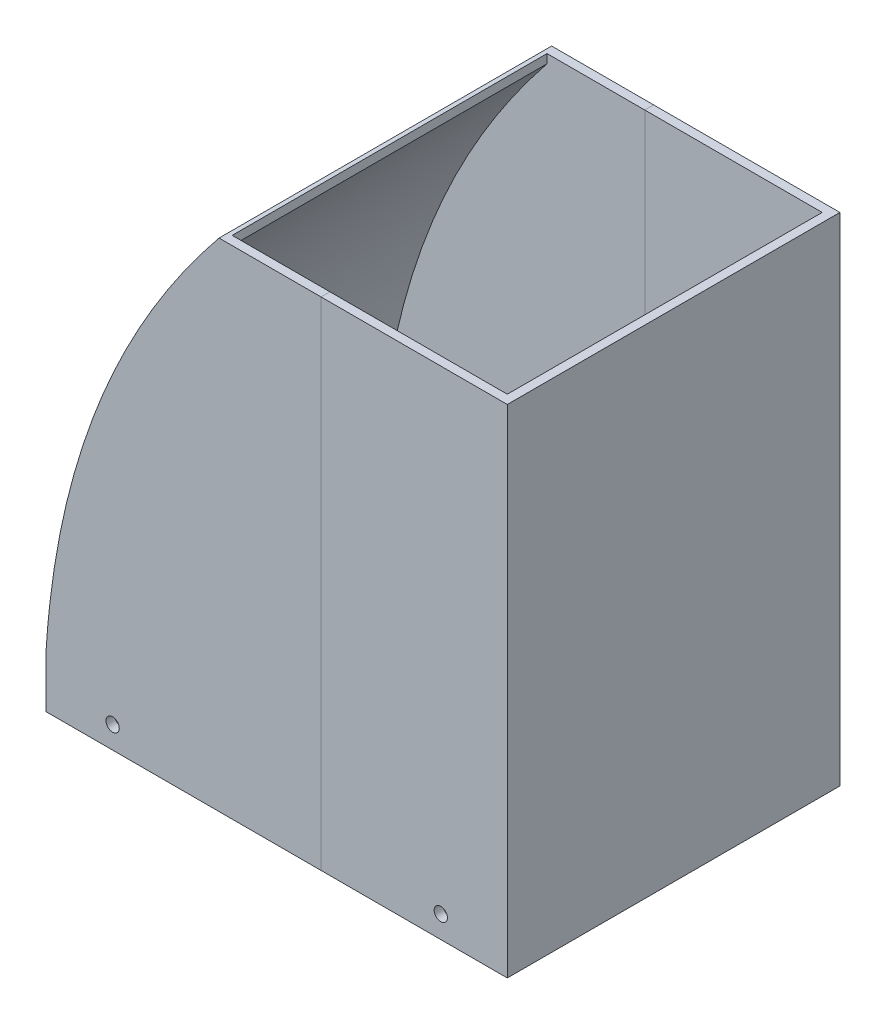
ISO-10303-21;
HEADER;
FILE_DESCRIPTION(('STEP AP214'),'2;1');
FILE_NAME('part.step','',(''),(''),'','','');
FILE_SCHEMA(('AUTOMOTIVE_DESIGN { 1 0 10303 214 1 1 1 1 }'));
ENDSEC;
DATA;
#1=APPLICATION_CONTEXT('core data for automotive mechanical design processes');
#2=APPLICATION_PROTOCOL_DEFINITION('international standard','automotive_design',2000,#1);
#3=PRODUCT_CONTEXT('',#1,'mechanical');
#4=PRODUCT('Part','Part','',(#3));
#5=PRODUCT_RELATED_PRODUCT_CATEGORY('part','',(#4));
#6=PRODUCT_DEFINITION_FORMATION('','',#4);
#7=PRODUCT_DEFINITION_CONTEXT('part definition',#1,'design');
#8=PRODUCT_DEFINITION('design','',#6,#7);
#9=PRODUCT_DEFINITION_SHAPE('','',#8);
#10=(LENGTH_UNIT() NAMED_UNIT(*) SI_UNIT(.MILLI.,.METRE.));
#11=(NAMED_UNIT(*) PLANE_ANGLE_UNIT() SI_UNIT($,.RADIAN.));
#12=(NAMED_UNIT(*) SI_UNIT($,.STERADIAN.) SOLID_ANGLE_UNIT());
#13=UNCERTAINTY_MEASURE_WITH_UNIT(LENGTH_MEASURE(1.E-05),#10,'distance_accuracy_value','');
#14=(GEOMETRIC_REPRESENTATION_CONTEXT(3) GLOBAL_UNCERTAINTY_ASSIGNED_CONTEXT((#13)) GLOBAL_UNIT_ASSIGNED_CONTEXT((#10,
#11,#12)) REPRESENTATION_CONTEXT('',''));
#15=CARTESIAN_POINT('',(0.,0.,0.));
#16=DIRECTION('',(0.,0.,1.));
#17=DIRECTION('',(1.,0.,0.));
#18=AXIS2_PLACEMENT_3D('',#15,#16,#17);
#19=CARTESIAN_POINT('',(10.,0.,0.));
#20=DIRECTION('',(1.,0.,0.));
#21=DIRECTION('',(0.,0.,-1.));
#22=AXIS2_PLACEMENT_3D('',#19,#20,#21);
#23=PLANE('',#22);
#24=DIRECTION('',(0.,0.,-1.));
#25=VECTOR('',#24,1.);
#26=CARTESIAN_POINT('',(10.,0.,0.));
#27=LINE('',#26,#25);
#28=CARTESIAN_POINT('',(10.,0.,-35.5));
#29=VERTEX_POINT('',#28);
#30=CARTESIAN_POINT('',(9.99999999999999,0.,-37.5));
#31=VERTEX_POINT('',#30);
#32=EDGE_CURVE('E164',#29,#31,#27,.T.);
#33=ORIENTED_EDGE('',*,*,#32,.T.);
#34=DIRECTION('',(0.,1.,0.));
#35=VECTOR('',#34,1.);
#36=CARTESIAN_POINT('',(10.,12.,-37.5));
#37=LINE('',#36,#35);
#38=CARTESIAN_POINT('',(10.,112.,-37.5));
#39=VERTEX_POINT('',#38);
#40=EDGE_CURVE('E157',#31,#39,#37,.T.);
#41=ORIENTED_EDGE('',*,*,#40,.T.);
#42=DIRECTION('',(0.,0.,-1.));
#43=VECTOR('',#42,1.);
#44=CARTESIAN_POINT('',(10.,112.,-37.5));
#45=LINE('',#44,#43);
#46=CARTESIAN_POINT('',(10.,112.,-35.5));
#47=VERTEX_POINT('',#46);
#48=EDGE_CURVE('E229',#47,#39,#45,.T.);
#49=ORIENTED_EDGE('',*,*,#48,.F.);
#50=DIRECTION('',(0.,1.,0.));
#51=VECTOR('',#50,1.);
#52=CARTESIAN_POINT('',(10.,12.,-35.5));
#53=LINE('',#52,#51);
#54=EDGE_CURVE('E226',#29,#47,#53,.T.);
#55=ORIENTED_EDGE('',*,*,#54,.F.);
#56=EDGE_LOOP('',(#33,#41,#49,#55));
#57=FACE_BOUND('',#56,.T.);
#58=ADVANCED_FACE('F50',(#57),#23,.T.);
#59=CARTESIAN_POINT('',(10.,112.,37.5));
#60=VERTEX_POINT('',#59);
#61=CARTESIAN_POINT('',(10.,112.,35.5));
#62=VERTEX_POINT('',#61);
#63=EDGE_CURVE('E155',#60,#62,#45,.T.);
#64=ORIENTED_EDGE('',*,*,#63,.F.);
#65=DIRECTION('',(0.,-1.,0.));
#66=VECTOR('',#65,1.);
#67=CARTESIAN_POINT('',(10.,12.,37.5));
#68=LINE('',#67,#66);
#69=CARTESIAN_POINT('',(10.,0.,37.5));
#70=VERTEX_POINT('',#69);
#71=EDGE_CURVE('E138',#60,#70,#68,.T.);
#72=ORIENTED_EDGE('',*,*,#71,.T.);
#73=CARTESIAN_POINT('',(10.,0.,35.5));
#74=VERTEX_POINT('',#73);
#75=EDGE_CURVE('E152',#70,#74,#27,.T.);
#76=ORIENTED_EDGE('',*,*,#75,.T.);
#77=DIRECTION('',(0.,-1.,0.));
#78=VECTOR('',#77,1.);
#79=CARTESIAN_POINT('',(10.,12.,35.5));
#80=LINE('',#79,#78);
#81=EDGE_CURVE('E222',#62,#74,#80,.T.);
#82=ORIENTED_EDGE('',*,*,#81,.F.);
#83=EDGE_LOOP('',(#64,#72,#76,#82));
#84=FACE_BOUND('',#83,.T.);
#85=ADVANCED_FACE('F151',(#84),#23,.T.);
#86=CARTESIAN_POINT('',(-52.,12.,-37.5));
#87=DIRECTION('',(1.,0.,0.));
#88=DIRECTION('',(0.,0.,-1.));
#89=AXIS2_PLACEMENT_3D('',#86,#87,#88);
#90=PLANE('',#89);
#91=DIRECTION('',(0.,0.,1.));
#92=VECTOR('',#91,1.);
#93=CARTESIAN_POINT('',(-52.,0.,-37.5));
#94=LINE('',#93,#92);
#95=CARTESIAN_POINT('',(-52.,0.,-37.5));
#96=VERTEX_POINT('',#95);
#97=CARTESIAN_POINT('',(-52.,0.,37.5));
#98=VERTEX_POINT('',#97);
#99=EDGE_CURVE('E146',#96,#98,#94,.T.);
#100=ORIENTED_EDGE('',*,*,#99,.T.);
#101=DIRECTION('',(0.,-1.,0.));
#102=VECTOR('',#101,1.);
#103=CARTESIAN_POINT('',(-52.,12.,37.5));
#104=LINE('',#103,#102);
#105=CARTESIAN_POINT('',(-52.,12.,37.5));
#106=VERTEX_POINT('',#105);
#107=EDGE_CURVE('E141',#106,#98,#104,.T.);
#108=ORIENTED_EDGE('',*,*,#107,.F.);
#109=DIRECTION('',(0.,0.,1.));
#110=VECTOR('',#109,1.);
#111=CARTESIAN_POINT('',(-52.,12.,-37.5));
#112=LINE('',#111,#110);
#113=CARTESIAN_POINT('',(-52.,12.,-37.5));
#114=VERTEX_POINT('',#113);
#115=EDGE_CURVE('E147',#114,#106,#112,.T.);
#116=ORIENTED_EDGE('',*,*,#115,.F.);
#117=DIRECTION('',(0.,-1.,0.));
#118=VECTOR('',#117,1.);
#119=CARTESIAN_POINT('',(-52.,12.,-37.5));
#120=LINE('',#119,#118);
#121=EDGE_CURVE('E225',#114,#96,#120,.T.);
#122=ORIENTED_EDGE('',*,*,#121,.T.);
#123=EDGE_LOOP('',(#100,#108,#116,#122));
#124=FACE_BOUND('',#123,.T.);
#125=ADVANCED_FACE('F319',(#124),#90,.F.);
#126=CARTESIAN_POINT('',(-13.0000000000001,112.,-37.5));
#127=CARTESIAN_POINT('',(-48.4598097712024,68.3634490424018,-37.5));
#128=CARTESIAN_POINT('',(-52.,12.,-37.5));
#129=B_SPLINE_CURVE_WITH_KNOTS('',2,(#126,#127,#128),.UNSPECIFIED.,.F.,.F.,(3,3),(0.,1.),.UNSPECIFIED.);
#130=DIRECTION('',(0.,0.,1.));
#131=VECTOR('',#130,1.);
#132=SURFACE_OF_LINEAR_EXTRUSION('',#129,#131);
#133=CARTESIAN_POINT('',(-13.0000000000001,112.,37.5));
#134=CARTESIAN_POINT('',(-48.4598097712024,68.3634490424018,37.5));
#135=CARTESIAN_POINT('',(-52.,12.,37.5));
#136=B_SPLINE_CURVE_WITH_KNOTS('',2,(#133,#134,#135),.UNSPECIFIED.,.F.,.F.,(3,3),(0.,1.),.UNSPECIFIED.);
#137=CARTESIAN_POINT('',(-13.0000000000001,112.,37.5));
#138=VERTEX_POINT('',#137);
#139=EDGE_CURVE('E177',#138,#106,#136,.T.);
#140=ORIENTED_EDGE('',*,*,#139,.F.);
#141=DIRECTION('',(0.,0.,1.));
#142=VECTOR('',#141,1.);
#143=CARTESIAN_POINT('',(-13.0000000000001,112.,-37.5));
#144=LINE('',#143,#142);
#145=CARTESIAN_POINT('',(-13.0000000000001,112.,-37.5));
#146=VERTEX_POINT('',#145);
#147=EDGE_CURVE('E173',#146,#138,#144,.T.);
#148=ORIENTED_EDGE('',*,*,#147,.F.);
#149=EDGE_CURVE('E178',#146,#114,#129,.T.);
#150=ORIENTED_EDGE('',*,*,#149,.T.);
#151=ORIENTED_EDGE('',*,*,#115,.T.);
#152=EDGE_LOOP('',(#140,#148,#150,#151));
#153=FACE_BOUND('',#152,.T.);
#154=ADVANCED_FACE('F247',(#153),#132,.T.);
#155=CARTESIAN_POINT('',(-52.,12.,-37.5));
#156=DIRECTION('',(0.,0.,1.));
#157=DIRECTION('',(1.,0.,0.));
#158=AXIS2_PLACEMENT_3D('',#155,#156,#157);
#159=PLANE('',#158);
#160=CARTESIAN_POINT('',(-37.,5.,-37.5));
#161=DIRECTION('',(0.,0.,1.));
#162=DIRECTION('',(1.,0.,0.));
#163=AXIS2_PLACEMENT_3D('',#160,#161,#162);
#164=CIRCLE('',#163,1.5);
#165=CARTESIAN_POINT('',(-35.5,5.,-37.5));
#166=VERTEX_POINT('',#165);
#167=EDGE_CURVE('E62',#166,#166,#164,.T.);
#168=ORIENTED_EDGE('',*,*,#167,.T.);
#169=EDGE_LOOP('',(#168));
#170=FACE_BOUND('',#169,.T.);
#171=ORIENTED_EDGE('',*,*,#40,.F.);
#172=DIRECTION('',(-1.,0.,0.));
#173=VECTOR('',#172,1.);
#174=CARTESIAN_POINT('',(-52.,0.,-37.5));
#175=LINE('',#174,#173);
#176=EDGE_CURVE('E170',#31,#96,#175,.T.);
#177=ORIENTED_EDGE('',*,*,#176,.T.);
#178=ORIENTED_EDGE('',*,*,#121,.F.);
#179=ORIENTED_EDGE('',*,*,#149,.F.);
#180=DIRECTION('',(-1.,0.,0.));
#181=VECTOR('',#180,1.);
#182=CARTESIAN_POINT('',(52.,112.,-37.5));
#183=LINE('',#182,#181);
#184=EDGE_CURVE('E174',#39,#146,#183,.T.);
#185=ORIENTED_EDGE('',*,*,#184,.F.);
#186=EDGE_LOOP('',(#171,#177,#178,#179,#185));
#187=FACE_BOUND('',#186,.T.);
#188=ADVANCED_FACE('F240',(#170,#187),#159,.F.);
#189=CARTESIAN_POINT('',(-52.,12.,37.5));
#190=DIRECTION('',(0.,0.,-1.));
#191=DIRECTION('',(-1.,0.,0.));
#192=AXIS2_PLACEMENT_3D('',#189,#190,#191);
#193=PLANE('',#192);
#194=CARTESIAN_POINT('',(-37.,5.,37.5));
#195=DIRECTION('',(0.,0.,1.));
#196=DIRECTION('',(1.,0.,0.));
#197=AXIS2_PLACEMENT_3D('',#194,#195,#196);
#198=CIRCLE('',#197,1.5);
#199=CARTESIAN_POINT('',(-35.5,5.,37.5));
#200=VERTEX_POINT('',#199);
#201=EDGE_CURVE('E13',#200,#200,#198,.T.);
#202=ORIENTED_EDGE('',*,*,#201,.F.);
#203=EDGE_LOOP('',(#202));
#204=FACE_BOUND('',#203,.T.);
#205=ORIENTED_EDGE('',*,*,#71,.F.);
#206=DIRECTION('',(-1.,0.,0.));
#207=VECTOR('',#206,1.);
#208=CARTESIAN_POINT('',(52.,112.,37.5));
#209=LINE('',#208,#207);
#210=EDGE_CURVE('E179',#60,#138,#209,.T.);
#211=ORIENTED_EDGE('',*,*,#210,.T.);
#212=ORIENTED_EDGE('',*,*,#139,.T.);
#213=ORIENTED_EDGE('',*,*,#107,.T.);
#214=DIRECTION('',(1.,0.,0.));
#215=VECTOR('',#214,1.);
#216=CARTESIAN_POINT('',(-52.,0.,37.5));
#217=LINE('',#216,#215);
#218=EDGE_CURVE('E135',#98,#70,#217,.T.);
#219=ORIENTED_EDGE('',*,*,#218,.T.);
#220=EDGE_LOOP('',(#205,#211,#212,#213,#219));
#221=FACE_BOUND('',#220,.T.);
#222=ADVANCED_FACE('F137',(#204,#221),#193,.F.);
#223=CARTESIAN_POINT('',(-12.0450935402186,112.,35.5));
#224=DIRECTION('',(-1.,0.,0.));
#225=DIRECTION('',(0.,-1.,0.));
#226=AXIS2_PLACEMENT_3D('',#223,#224,#225);
#227=PLANE('',#226);
#228=DIRECTION('',(0.,0.,1.));
#229=VECTOR('',#228,1.);
#230=CARTESIAN_POINT('',(-12.0450935402186,110.,-35.5));
#231=LINE('',#230,#229);
#232=CARTESIAN_POINT('',(-12.0450935402186,110.,-35.5));
#233=VERTEX_POINT('',#232);
#234=CARTESIAN_POINT('',(-12.0450935402186,110.,35.5));
#235=VERTEX_POINT('',#234);
#236=EDGE_CURVE('E189',#233,#235,#231,.T.);
#237=ORIENTED_EDGE('',*,*,#236,.F.);
#238=DIRECTION('',(0.,-1.,0.));
#239=VECTOR('',#238,1.);
#240=CARTESIAN_POINT('',(-12.0450935402186,112.,-35.5));
#241=LINE('',#240,#239);
#242=CARTESIAN_POINT('',(-12.0450935402186,112.,-35.5));
#243=VERTEX_POINT('',#242);
#244=EDGE_CURVE('E69',#243,#233,#241,.T.);
#245=ORIENTED_EDGE('',*,*,#244,.F.);
#246=DIRECTION('',(0.,0.,-1.));
#247=VECTOR('',#246,1.);
#248=CARTESIAN_POINT('',(-12.0450935402186,112.,35.5));
#249=LINE('',#248,#247);
#250=CARTESIAN_POINT('',(-12.0450935402186,112.,35.5));
#251=VERTEX_POINT('',#250);
#252=EDGE_CURVE('E193',#251,#243,#249,.T.);
#253=ORIENTED_EDGE('',*,*,#252,.F.);
#254=DIRECTION('',(0.,-1.,0.));
#255=VECTOR('',#254,1.);
#256=CARTESIAN_POINT('',(-12.0450935402186,112.,35.5));
#257=LINE('',#256,#255);
#258=EDGE_CURVE('E194',#251,#235,#257,.T.);
#259=ORIENTED_EDGE('',*,*,#258,.T.);
#260=EDGE_LOOP('',(#237,#245,#253,#259));
#261=FACE_BOUND('',#260,.T.);
#262=ADVANCED_FACE('F282',(#261),#227,.F.);
#263=CARTESIAN_POINT('',(-13.0000000000001,112.,-37.5));
#264=CARTESIAN_POINT('',(-48.4598097712024,68.3634490424018,-37.5));
#265=CARTESIAN_POINT('',(-52.,12.,-37.5));
#266=B_SPLINE_CURVE_WITH_KNOTS('',2,(#263,#264,#265),.UNSPECIFIED.,.F.,.F.,(3,3),(0.,1.),.UNSPECIFIED.);
#267=DIRECTION('',(0.,0.,1.));
#268=VECTOR('',#267,1.);
#269=SURFACE_OF_LINEAR_EXTRUSION('',#266,#268);
#270=OFFSET_SURFACE('',#269,-2.,.F.);
#271=CARTESIAN_POINT('',(-12.0450935402186,110.,35.5));
#272=CARTESIAN_POINT('',(-13.0442845313018,108.757810398391,35.5));
#273=CARTESIAN_POINT('',(-14.0278272882565,107.503001932952,35.5));
#274=CARTESIAN_POINT('',(-15.9623891529147,104.96831549086,35.5));
#275=CARTESIAN_POINT('',(-16.9134041743009,103.688434395975,35.5));
#276=CARTESIAN_POINT('',(-18.7814646121598,101.104037721084,35.5));
#277=CARTESIAN_POINT('',(-19.698508862466,99.7995212977005,35.5));
#278=CARTESIAN_POINT('',(-21.4969742758123,97.1668080235757,35.5));
#279=CARTESIAN_POINT('',(-22.3784075429143,95.838619443943,35.5));
#280=CARTESIAN_POINT('',(-24.1046903560787,93.1587339475502,35.5));
#281=CARTESIAN_POINT('',(-24.9495411540018,91.8070378374454,35.5));
#282=CARTESIAN_POINT('',(-26.6014812131027,89.0807793521403,35.5));
#283=CARTESIAN_POINT('',(-27.4085709470632,87.7062172635229,35.5));
#284=CARTESIAN_POINT('',(-28.9581275091827,84.9802875285094,35.5));
#285=CARTESIAN_POINT('',(-29.7018443478846,83.6296304105258,35.5));
#286=CARTESIAN_POINT('',(-31.1519736251426,80.9084258294078,35.5));
#287=CARTESIAN_POINT('',(-31.8583859527163,79.537878307114,35.5));
#288=CARTESIAN_POINT('',(-33.2330479330031,76.7778076315907,35.5));
#289=CARTESIAN_POINT('',(-33.9012983412077,75.3882848546897,35.5));
#290=CARTESIAN_POINT('',(-35.1990429263643,72.5909202966371,35.5));
#291=CARTESIAN_POINT('',(-35.8285293814212,71.183074932797,35.5));
#292=CARTESIAN_POINT('',(-37.0479913789742,68.350333074551,35.5));
#293=CARTESIAN_POINT('',(-37.6379659795101,66.9254361745915,35.5));
#294=CARTESIAN_POINT('',(-38.7779286022278,64.0596048610437,35.5));
#295=CARTESIAN_POINT('',(-39.3279133407107,62.6186691416322,35.5));
#296=CARTESIAN_POINT('',(-40.4341690445599,59.5943297135508,35.5));
#297=CARTESIAN_POINT('',(-40.9867205531453,58.0095640988418,35.5));
#298=CARTESIAN_POINT('',(-42.0437553168679,54.8237329698892,35.5));
#299=CARTESIAN_POINT('',(-42.5482287834835,53.2226642095126,35.5));
#300=CARTESIAN_POINT('',(-43.5089526733596,50.0057633689669,35.5));
#301=CARTESIAN_POINT('',(-43.9651930403952,48.3899282861298,35.5));
#302=CARTESIAN_POINT('',(-44.8294645173356,45.1450867592366,35.5));
#303=CARTESIAN_POINT('',(-45.2374862714721,43.5160778243794,35.5));
#304=CARTESIAN_POINT('',(-46.0055023806024,40.2465260395472,35.5));
#305=CARTESIAN_POINT('',(-46.3654895135196,38.6059814941222,35.5));
#306=CARTESIAN_POINT('',(-47.038833936755,35.3098854868856,35.5));
#307=CARTESIAN_POINT('',(-47.352038240524,33.654302794313,35.5));
#308=CARTESIAN_POINT('',(-47.9309707151973,30.3349686144209,35.5));
#309=CARTESIAN_POINT('',(-48.1967017345043,28.6712176233589,35.5));
#310=CARTESIAN_POINT('',(-48.6813601254276,25.3372621981366,35.5));
#311=CARTESIAN_POINT('',(-48.9002969014934,23.6670591295027,35.5));
#312=CARTESIAN_POINT('',(-49.2921760817379,20.321939814872,35.5));
#313=CARTESIAN_POINT('',(-49.4651363916117,18.6470256612085,35.5));
#314=CARTESIAN_POINT('',(-49.7660324666382,15.2942209793064,35.5));
#315=CARTESIAN_POINT('',(-49.8939966365321,13.6163330032197,35.5));
#316=CARTESIAN_POINT('',(-50.,11.9370901730026,35.5));
#317=B_SPLINE_CURVE_WITH_KNOTS('',3,(#271,#272,#273,#274,#275,#276,#277,#278,#279,#280,#281,
#282,#283,#284,#285,#286,#287,#288,#289,#290,#291,#292,#293,#294,#295,#296,#297,#298,#299,#300,
#301,#302,#303,#304,#305,#306,#307,#308,#309,#310,#311,#312,#313,#314,#315,#316),.UNSPECIFIED.,
.F.,.F.,(4,2,2,2,2,2,2,2,2,2,2,2,2,2,2,2,2,2,2,2,2,2,4),(0.,4.78245728821157,9.5655131852798,
14.3487331257417,19.1303133468221,23.9117298115903,28.6930863951859,33.3181513285633,
37.9432300209306,42.5682171188471,47.1941225673799,51.8201382579969,56.4465333779739,
61.4807438958199,66.5159771815259,71.5522582122664,76.5895148244745,81.6275279443538,
86.6816714351774,91.7355115748623,96.7883350645137,101.839187821742,106.886846375589),.UNSPECIFIED.);
#318=CARTESIAN_POINT('',(-50.,11.9370901730026,35.5));
#319=VERTEX_POINT('',#318);
#320=EDGE_CURVE('E206',#235,#319,#317,.T.);
#321=ORIENTED_EDGE('',*,*,#320,.T.);
#322=DIRECTION('',(0.,0.,1.));
#323=VECTOR('',#322,1.);
#324=CARTESIAN_POINT('',(-50.0000000000001,11.9370901730023,-35.5));
#325=LINE('',#324,#323);
#326=CARTESIAN_POINT('',(-50.0000000000001,11.9370901730023,-35.5));
#327=VERTEX_POINT('',#326);
#328=EDGE_CURVE('E186',#327,#319,#325,.T.);
#329=ORIENTED_EDGE('',*,*,#328,.F.);
#330=CARTESIAN_POINT('',(-12.0450935402186,110.,-35.5));
#331=CARTESIAN_POINT('',(-13.0442845313018,108.757810398391,-35.5));
#332=CARTESIAN_POINT('',(-14.0278272882565,107.503001932952,-35.5));
#333=CARTESIAN_POINT('',(-15.9623891529147,104.96831549086,-35.5));
#334=CARTESIAN_POINT('',(-16.9134041743009,103.688434395975,-35.5));
#335=CARTESIAN_POINT('',(-18.7814646121598,101.104037721084,-35.5));
#336=CARTESIAN_POINT('',(-19.698508862466,99.7995212977005,-35.5));
#337=CARTESIAN_POINT('',(-21.4969742758123,97.1668080235757,-35.5));
#338=CARTESIAN_POINT('',(-22.3784075429143,95.838619443943,-35.5));
#339=CARTESIAN_POINT('',(-24.1046903560787,93.1587339475502,-35.5));
#340=CARTESIAN_POINT('',(-24.9495411540018,91.8070378374454,-35.5));
#341=CARTESIAN_POINT('',(-26.6014812131027,89.0807793521403,-35.5));
#342=CARTESIAN_POINT('',(-27.4085709470632,87.7062172635229,-35.5));
#343=CARTESIAN_POINT('',(-28.9581275091827,84.9802875285094,-35.5));
#344=CARTESIAN_POINT('',(-29.7018443478846,83.6296304105258,-35.5));
#345=CARTESIAN_POINT('',(-31.1519736251426,80.9084258294078,-35.5));
#346=CARTESIAN_POINT('',(-31.8583859527163,79.537878307114,-35.5));
#347=CARTESIAN_POINT('',(-33.2330479330031,76.7778076315907,-35.5));
#348=CARTESIAN_POINT('',(-33.9012983412077,75.3882848546897,-35.5));
#349=CARTESIAN_POINT('',(-35.1990429263642,72.5909202966371,-35.5));
#350=CARTESIAN_POINT('',(-35.8285293814212,71.183074932797,-35.5));
#351=CARTESIAN_POINT('',(-37.0479913789742,68.350333074551,-35.5));
#352=CARTESIAN_POINT('',(-37.6379659795101,66.9254361745915,-35.5));
#353=CARTESIAN_POINT('',(-38.7779286022278,64.0596048610437,-35.5));
#354=CARTESIAN_POINT('',(-39.3279133407107,62.6186691416322,-35.5));
#355=CARTESIAN_POINT('',(-40.43416904456,59.5943297135508,-35.5));
#356=CARTESIAN_POINT('',(-40.9867205531453,58.0095640988418,-35.5));
#357=CARTESIAN_POINT('',(-42.043755316868,54.8237329698891,-35.5));
#358=CARTESIAN_POINT('',(-42.5482287834835,53.2226642095126,-35.5));
#359=CARTESIAN_POINT('',(-43.5089526733596,50.0057633689669,-35.5));
#360=CARTESIAN_POINT('',(-43.9651930403952,48.3899282861298,-35.5));
#361=CARTESIAN_POINT('',(-44.8294645173357,45.1450867592365,-35.5));
#362=CARTESIAN_POINT('',(-45.2374862714721,43.5160778243793,-35.5));
#363=CARTESIAN_POINT('',(-46.0055023806024,40.2465260395471,-35.5));
#364=CARTESIAN_POINT('',(-46.3654895135196,38.605981494122,-35.5));
#365=CARTESIAN_POINT('',(-47.038833936755,35.3098854868855,-35.5));
#366=CARTESIAN_POINT('',(-47.352038240524,33.6543027943129,-35.5));
#367=CARTESIAN_POINT('',(-47.9309707151973,30.3349686144208,-35.5));
#368=CARTESIAN_POINT('',(-48.1967017345043,28.6712176233587,-35.5));
#369=CARTESIAN_POINT('',(-48.6813601254276,25.3372621981364,-35.5));
#370=CARTESIAN_POINT('',(-48.9002969014934,23.6670591295025,-35.5));
#371=CARTESIAN_POINT('',(-49.2921760817379,20.3219398148717,-35.5));
#372=CARTESIAN_POINT('',(-49.4651363916117,18.6470256612082,-35.5));
#373=CARTESIAN_POINT('',(-49.7660324666382,15.2942209793062,-35.5));
#374=CARTESIAN_POINT('',(-49.8939966365322,13.6163330032194,-35.5));
#375=CARTESIAN_POINT('',(-50.0000000000001,11.9370901730023,-35.5));
#376=B_SPLINE_CURVE_WITH_KNOTS('',3,(#330,#331,#332,#333,#334,#335,#336,#337,#338,#339,#340,
#341,#342,#343,#344,#345,#346,#347,#348,#349,#350,#351,#352,#353,#354,#355,#356,#357,#358,#359,
#360,#361,#362,#363,#364,#365,#366,#367,#368,#369,#370,#371,#372,#373,#374,#375),.UNSPECIFIED.,
.F.,.F.,(4,2,2,2,2,2,2,2,2,2,2,2,2,2,2,2,2,2,2,2,2,2,4),(0.,4.78245728821157,9.56551318527979,
14.3487331257417,19.1303133468221,23.9117298115903,28.6930863951859,33.3181513285633,
37.9432300209306,42.5682171188471,47.1941225673799,51.8201382579969,56.4465333779739,
61.48074389582,66.5159771815259,71.5522582122665,76.5895148244745,81.627527944354,
86.6816714351776,91.7355115748625,96.7883350645139,101.839187821742,106.886846375589),.UNSPECIFIED.);
#377=EDGE_CURVE('E266',#233,#327,#376,.T.);
#378=ORIENTED_EDGE('',*,*,#377,.F.);
#379=ORIENTED_EDGE('',*,*,#236,.T.);
#380=EDGE_LOOP('',(#321,#329,#378,#379));
#381=FACE_BOUND('',#380,.T.);
#382=ADVANCED_FACE('F276',(#381),#270,.F.);
#383=CARTESIAN_POINT('',(-50.,12.,-37.5));
#384=DIRECTION('',(1.,0.,0.));
#385=DIRECTION('',(0.,0.,-1.));
#386=AXIS2_PLACEMENT_3D('',#383,#384,#385);
#387=PLANE('',#386);
#388=DIRECTION('',(0.,0.,1.));
#389=VECTOR('',#388,1.);
#390=CARTESIAN_POINT('',(-50.,0.,-37.5));
#391=LINE('',#390,#389);
#392=CARTESIAN_POINT('',(-50.,0.,-35.5));
#393=VERTEX_POINT('',#392);
#394=CARTESIAN_POINT('',(-50.,0.,35.5));
#395=VERTEX_POINT('',#394);
#396=EDGE_CURVE('E185',#393,#395,#391,.T.);
#397=ORIENTED_EDGE('',*,*,#396,.F.);
#398=DIRECTION('',(0.,-1.,0.));
#399=VECTOR('',#398,1.);
#400=CARTESIAN_POINT('',(-50.,12.,-35.5));
#401=LINE('',#400,#399);
#402=EDGE_CURVE('E182',#327,#393,#401,.T.);
#403=ORIENTED_EDGE('',*,*,#402,.F.);
#404=ORIENTED_EDGE('',*,*,#328,.T.);
#405=DIRECTION('',(0.,-1.,0.));
#406=VECTOR('',#405,1.);
#407=CARTESIAN_POINT('',(-50.,12.,35.5));
#408=LINE('',#407,#406);
#409=EDGE_CURVE('E294',#319,#395,#408,.T.);
#410=ORIENTED_EDGE('',*,*,#409,.T.);
#411=EDGE_LOOP('',(#397,#403,#404,#410));
#412=FACE_BOUND('',#411,.T.);
#413=ADVANCED_FACE('F281',(#412),#387,.T.);
#414=CARTESIAN_POINT('',(0.,0.,0.));
#415=DIRECTION('',(0.,1.,0.));
#416=DIRECTION('',(0.,0.,1.));
#417=AXIS2_PLACEMENT_3D('',#414,#415,#416);
#418=PLANE('',#417);
#419=ORIENTED_EDGE('',*,*,#75,.F.);
#420=ORIENTED_EDGE('',*,*,#218,.F.);
#421=ORIENTED_EDGE('',*,*,#99,.F.);
#422=ORIENTED_EDGE('',*,*,#176,.F.);
#423=ORIENTED_EDGE('',*,*,#32,.F.);
#424=DIRECTION('',(-1.,0.,0.));
#425=VECTOR('',#424,1.);
#426=CARTESIAN_POINT('',(-52.,0.,-35.5));
#427=LINE('',#426,#425);
#428=EDGE_CURVE('E187',#29,#393,#427,.T.);
#429=ORIENTED_EDGE('',*,*,#428,.T.);
#430=ORIENTED_EDGE('',*,*,#396,.T.);
#431=DIRECTION('',(1.,0.,0.));
#432=VECTOR('',#431,1.);
#433=CARTESIAN_POINT('',(-52.,0.,35.5));
#434=LINE('',#433,#432);
#435=EDGE_CURVE('E162',#395,#74,#434,.T.);
#436=ORIENTED_EDGE('',*,*,#435,.T.);
#437=EDGE_LOOP('',(#419,#420,#421,#422,#423,#429,#430,#436));
#438=FACE_BOUND('',#437,.T.);
#439=ADVANCED_FACE('F159',(#438),#418,.F.);
#440=CARTESIAN_POINT('',(52.,112.,-37.5));
#441=DIRECTION('',(0.,1.,0.));
#442=DIRECTION('',(-1.,0.,0.));
#443=AXIS2_PLACEMENT_3D('',#440,#441,#442);
#444=PLANE('',#443);
#445=ORIENTED_EDGE('',*,*,#210,.F.);
#446=ORIENTED_EDGE('',*,*,#63,.T.);
#447=DIRECTION('',(-1.,0.,0.));
#448=VECTOR('',#447,1.);
#449=CARTESIAN_POINT('',(50.,112.,35.5));
#450=LINE('',#449,#448);
#451=EDGE_CURVE('E55',#62,#251,#450,.T.);
#452=ORIENTED_EDGE('',*,*,#451,.T.);
#453=ORIENTED_EDGE('',*,*,#252,.T.);
#454=DIRECTION('',(1.,0.,0.));
#455=VECTOR('',#454,1.);
#456=CARTESIAN_POINT('',(-12.0450935402186,112.,-35.5));
#457=LINE('',#456,#455);
#458=EDGE_CURVE('E190',#243,#47,#457,.T.);
#459=ORIENTED_EDGE('',*,*,#458,.T.);
#460=ORIENTED_EDGE('',*,*,#48,.T.);
#461=ORIENTED_EDGE('',*,*,#184,.T.);
#462=ORIENTED_EDGE('',*,*,#147,.T.);
#463=EDGE_LOOP('',(#445,#446,#452,#453,#459,#460,#461,#462));
#464=FACE_BOUND('',#463,.T.);
#465=ADVANCED_FACE('F244',(#464),#444,.T.);
#466=CARTESIAN_POINT('',(-37.,5.,-37.5));
#467=DIRECTION('',(0.,0.,1.));
#468=DIRECTION('',(1.,0.,0.));
#469=AXIS2_PLACEMENT_3D('',#466,#467,#468);
#470=CYLINDRICAL_SURFACE('',#469,1.5);
#471=CARTESIAN_POINT('',(-37.,5.,35.5));
#472=DIRECTION('',(0.,0.,-1.));
#473=DIRECTION('',(-1.,0.,0.));
#474=AXIS2_PLACEMENT_3D('',#471,#472,#473);
#475=CIRCLE('',#474,1.5);
#476=CARTESIAN_POINT('',(-38.5,5.,35.5));
#477=VERTEX_POINT('',#476);
#478=EDGE_CURVE('E217',#477,#477,#475,.T.);
#479=ORIENTED_EDGE('',*,*,#478,.T.);
#480=EDGE_LOOP('',(#479));
#481=FACE_BOUND('',#480,.T.);
#482=ORIENTED_EDGE('',*,*,#201,.T.);
#483=EDGE_LOOP('',(#482));
#484=FACE_BOUND('',#483,.T.);
#485=ADVANCED_FACE('F303',(#481,#484),#470,.F.);
#486=CARTESIAN_POINT('',(-52.,12.,35.5));
#487=DIRECTION('',(0.,0.,-1.));
#488=DIRECTION('',(-1.,0.,0.));
#489=AXIS2_PLACEMENT_3D('',#486,#487,#488);
#490=PLANE('',#489);
#491=ORIENTED_EDGE('',*,*,#478,.F.);
#492=EDGE_LOOP('',(#491));
#493=FACE_BOUND('',#492,.T.);
#494=ORIENTED_EDGE('',*,*,#451,.F.);
#495=ORIENTED_EDGE('',*,*,#81,.T.);
#496=ORIENTED_EDGE('',*,*,#435,.F.);
#497=ORIENTED_EDGE('',*,*,#409,.F.);
#498=ORIENTED_EDGE('',*,*,#320,.F.);
#499=ORIENTED_EDGE('',*,*,#258,.F.);
#500=EDGE_LOOP('',(#494,#495,#496,#497,#498,#499));
#501=FACE_BOUND('',#500,.T.);
#502=ADVANCED_FACE('F52',(#493,#501),#490,.T.);
#503=CARTESIAN_POINT('',(-37.,5.,-35.5));
#504=DIRECTION('',(0.,0.,1.));
#505=DIRECTION('',(1.,0.,0.));
#506=AXIS2_PLACEMENT_3D('',#503,#504,#505);
#507=CIRCLE('',#506,1.5);
#508=CARTESIAN_POINT('',(-35.5,5.,-35.5));
#509=VERTEX_POINT('',#508);
#510=EDGE_CURVE('E214',#509,#509,#507,.T.);
#511=ORIENTED_EDGE('',*,*,#510,.T.);
#512=EDGE_LOOP('',(#511));
#513=FACE_BOUND('',#512,.T.);
#514=ORIENTED_EDGE('',*,*,#167,.F.);
#515=EDGE_LOOP('',(#514));
#516=FACE_BOUND('',#515,.T.);
#517=ADVANCED_FACE('F299',(#513,#516),#470,.F.);
#518=CARTESIAN_POINT('',(-52.,12.,-35.5));
#519=DIRECTION('',(0.,0.,1.));
#520=DIRECTION('',(1.,0.,0.));
#521=AXIS2_PLACEMENT_3D('',#518,#519,#520);
#522=PLANE('',#521);
#523=ORIENTED_EDGE('',*,*,#510,.F.);
#524=EDGE_LOOP('',(#523));
#525=FACE_BOUND('',#524,.T.);
#526=ORIENTED_EDGE('',*,*,#428,.F.);
#527=ORIENTED_EDGE('',*,*,#54,.T.);
#528=ORIENTED_EDGE('',*,*,#458,.F.);
#529=ORIENTED_EDGE('',*,*,#244,.T.);
#530=ORIENTED_EDGE('',*,*,#377,.T.);
#531=ORIENTED_EDGE('',*,*,#402,.T.);
#532=EDGE_LOOP('',(#526,#527,#528,#529,#530,#531));
#533=FACE_BOUND('',#532,.T.);
#534=ADVANCED_FACE('F295',(#525,#533),#522,.T.);
#535=CLOSED_SHELL('',(#58,#85,#125,#154,#188,#222,#262,#382,#413,#439,#465,#485,#502,#517,#534));
#536=MANIFOLD_SOLID_BREP('B2',#535);
#537=CARTESIAN_POINT('',(10.,0.,0.));
#538=DIRECTION('',(1.,0.,0.));
#539=DIRECTION('',(0.,0.,-1.));
#540=AXIS2_PLACEMENT_3D('',#537,#538,#539);
#541=PLANE('',#540);
#542=DIRECTION('',(0.,0.,-1.));
#543=VECTOR('',#542,1.);
#544=CARTESIAN_POINT('',(10.,0.,0.));
#545=LINE('',#544,#543);
#546=CARTESIAN_POINT('',(10.,0.,-35.5));
#547=VERTEX_POINT('',#546);
#548=CARTESIAN_POINT('',(9.99999999999999,0.,-37.5));
#549=VERTEX_POINT('',#548);
#550=EDGE_CURVE('E597',#547,#549,#545,.T.);
#551=ORIENTED_EDGE('',*,*,#550,.F.);
#552=DIRECTION('',(0.,1.,0.));
#553=VECTOR('',#552,1.);
#554=CARTESIAN_POINT('',(10.,12.,-35.5));
#555=LINE('',#554,#553);
#556=CARTESIAN_POINT('',(10.,112.,-35.5));
#557=VERTEX_POINT('',#556);
#558=EDGE_CURVE('E481',#547,#557,#555,.T.);
#559=ORIENTED_EDGE('',*,*,#558,.T.);
#560=DIRECTION('',(0.,0.,-1.));
#561=VECTOR('',#560,1.);
#562=CARTESIAN_POINT('',(10.,112.,-37.5));
#563=LINE('',#562,#561);
#564=CARTESIAN_POINT('',(10.,112.,-37.5));
#565=VERTEX_POINT('',#564);
#566=EDGE_CURVE('E548',#557,#565,#563,.T.);
#567=ORIENTED_EDGE('',*,*,#566,.T.);
#568=DIRECTION('',(0.,1.,0.));
#569=VECTOR('',#568,1.);
#570=CARTESIAN_POINT('',(10.,12.,-37.5));
#571=LINE('',#570,#569);
#572=EDGE_CURVE('E476',#549,#565,#571,.T.);
#573=ORIENTED_EDGE('',*,*,#572,.F.);
#574=EDGE_LOOP('',(#551,#559,#567,#573));
#575=FACE_BOUND('',#574,.T.);
#576=ADVANCED_FACE('F473',(#575),#541,.F.);
#577=CARTESIAN_POINT('',(10.,112.,37.5));
#578=VERTEX_POINT('',#577);
#579=CARTESIAN_POINT('',(10.,112.,35.5));
#580=VERTEX_POINT('',#579);
#581=EDGE_CURVE('E604',#578,#580,#563,.T.);
#582=ORIENTED_EDGE('',*,*,#581,.T.);
#583=DIRECTION('',(0.,-1.,0.));
#584=VECTOR('',#583,1.);
#585=CARTESIAN_POINT('',(10.,12.,35.5));
#586=LINE('',#585,#584);
#587=CARTESIAN_POINT('',(10.,0.,35.5));
#588=VERTEX_POINT('',#587);
#589=EDGE_CURVE('E48',#580,#588,#586,.T.);
#590=ORIENTED_EDGE('',*,*,#589,.T.);
#591=CARTESIAN_POINT('',(10.,0.,37.5));
#592=VERTEX_POINT('',#591);
#593=EDGE_CURVE('E489',#592,#588,#545,.T.);
#594=ORIENTED_EDGE('',*,*,#593,.F.);
#595=DIRECTION('',(0.,-1.,0.));
#596=VECTOR('',#595,1.);
#597=CARTESIAN_POINT('',(10.,12.,37.5));
#598=LINE('',#597,#596);
#599=EDGE_CURVE('E606',#578,#592,#598,.T.);
#600=ORIENTED_EDGE('',*,*,#599,.F.);
#601=EDGE_LOOP('',(#582,#590,#594,#600));
#602=FACE_BOUND('',#601,.T.);
#603=ADVANCED_FACE('F630',(#602),#541,.F.);
#604=CARTESIAN_POINT('',(51.9999999999999,12.,-37.5));
#605=DIRECTION('',(-1.,0.,0.));
#606=DIRECTION('',(0.,0.,1.));
#607=AXIS2_PLACEMENT_3D('',#604,#605,#606);
#608=PLANE('',#607);
#609=DIRECTION('',(0.,0.,-1.));
#610=VECTOR('',#609,1.);
#611=CARTESIAN_POINT('',(51.9999999999999,0.,-37.5));
#612=LINE('',#611,#610);
#613=CARTESIAN_POINT('',(52.,0.,37.5));
#614=VERTEX_POINT('',#613);
#615=CARTESIAN_POINT('',(51.9999999999999,0.,-37.5));
#616=VERTEX_POINT('',#615);
#617=EDGE_CURVE('E583',#614,#616,#612,.T.);
#618=ORIENTED_EDGE('',*,*,#617,.T.);
#619=DIRECTION('',(0.,-1.,0.));
#620=VECTOR('',#619,1.);
#621=CARTESIAN_POINT('',(51.9999999999999,12.,-37.5));
#622=LINE('',#621,#620);
#623=CARTESIAN_POINT('',(52.,112.,-37.5));
#624=VERTEX_POINT('',#623);
#625=EDGE_CURVE('E594',#624,#616,#622,.T.);
#626=ORIENTED_EDGE('',*,*,#625,.F.);
#627=DIRECTION('',(0.,0.,1.));
#628=VECTOR('',#627,1.);
#629=CARTESIAN_POINT('',(52.,112.,-37.5));
#630=LINE('',#629,#628);
#631=CARTESIAN_POINT('',(52.,112.,37.5));
#632=VERTEX_POINT('',#631);
#633=EDGE_CURVE('E578',#624,#632,#630,.T.);
#634=ORIENTED_EDGE('',*,*,#633,.T.);
#635=DIRECTION('',(0.,-1.,0.));
#636=VECTOR('',#635,1.);
#637=CARTESIAN_POINT('',(52.,12.,37.5));
#638=LINE('',#637,#636);
#639=EDGE_CURVE('E591',#632,#614,#638,.T.);
#640=ORIENTED_EDGE('',*,*,#639,.T.);
#641=EDGE_LOOP('',(#618,#626,#634,#640));
#642=FACE_BOUND('',#641,.T.);
#643=ADVANCED_FACE('F637',(#642),#608,.F.);
#644=CARTESIAN_POINT('',(-52.,12.,-37.5));
#645=DIRECTION('',(0.,0.,1.));
#646=DIRECTION('',(1.,0.,0.));
#647=AXIS2_PLACEMENT_3D('',#644,#645,#646);
#648=PLANE('',#647);
#649=CARTESIAN_POINT('',(37.,5.,-37.5));
#650=DIRECTION('',(0.,0.,1.));
#651=DIRECTION('',(1.,0.,0.));
#652=AXIS2_PLACEMENT_3D('',#649,#650,#651);
#653=CIRCLE('',#652,1.5);
#654=CARTESIAN_POINT('',(38.5,5.,-37.5));
#655=VERTEX_POINT('',#654);
#656=EDGE_CURVE('E601',#655,#655,#653,.T.);
#657=ORIENTED_EDGE('',*,*,#656,.T.);
#658=EDGE_LOOP('',(#657));
#659=FACE_BOUND('',#658,.T.);
#660=DIRECTION('',(-1.,0.,0.));
#661=VECTOR('',#660,1.);
#662=CARTESIAN_POINT('',(-52.,0.,-37.5));
#663=LINE('',#662,#661);
#664=EDGE_CURVE('E586',#616,#549,#663,.T.);
#665=ORIENTED_EDGE('',*,*,#664,.T.);
#666=ORIENTED_EDGE('',*,*,#572,.T.);
#667=DIRECTION('',(-1.,0.,0.));
#668=VECTOR('',#667,1.);
#669=CARTESIAN_POINT('',(52.,112.,-37.5));
#670=LINE('',#669,#668);
#671=EDGE_CURVE('E576',#624,#565,#670,.T.);
#672=ORIENTED_EDGE('',*,*,#671,.F.);
#673=ORIENTED_EDGE('',*,*,#625,.T.);
#674=EDGE_LOOP('',(#665,#666,#672,#673));
#675=FACE_BOUND('',#674,.T.);
#676=ADVANCED_FACE('F622',(#659,#675),#648,.F.);
#677=CARTESIAN_POINT('',(-52.,12.,37.5));
#678=DIRECTION('',(0.,0.,-1.));
#679=DIRECTION('',(-1.,0.,0.));
#680=AXIS2_PLACEMENT_3D('',#677,#678,#679);
#681=PLANE('',#680);
#682=CARTESIAN_POINT('',(37.,5.,37.5));
#683=DIRECTION('',(0.,0.,1.));
#684=DIRECTION('',(1.,0.,0.));
#685=AXIS2_PLACEMENT_3D('',#682,#683,#684);
#686=CIRCLE('',#685,1.5);
#687=CARTESIAN_POINT('',(38.5,5.,37.5));
#688=VERTEX_POINT('',#687);
#689=EDGE_CURVE('E616',#688,#688,#686,.T.);
#690=ORIENTED_EDGE('',*,*,#689,.F.);
#691=EDGE_LOOP('',(#690));
#692=FACE_BOUND('',#691,.T.);
#693=DIRECTION('',(-1.,0.,0.));
#694=VECTOR('',#693,1.);
#695=CARTESIAN_POINT('',(52.,112.,37.5));
#696=LINE('',#695,#694);
#697=EDGE_CURVE('E562',#632,#578,#696,.T.);
#698=ORIENTED_EDGE('',*,*,#697,.T.);
#699=ORIENTED_EDGE('',*,*,#599,.T.);
#700=DIRECTION('',(1.,0.,0.));
#701=VECTOR('',#700,1.);
#702=CARTESIAN_POINT('',(-52.,0.,37.5));
#703=LINE('',#702,#701);
#704=EDGE_CURVE('E589',#592,#614,#703,.T.);
#705=ORIENTED_EDGE('',*,*,#704,.T.);
#706=ORIENTED_EDGE('',*,*,#639,.F.);
#707=EDGE_LOOP('',(#698,#699,#705,#706));
#708=FACE_BOUND('',#707,.T.);
#709=ADVANCED_FACE('F661',(#692,#708),#681,.F.);
#710=CARTESIAN_POINT('',(0.,0.,0.));
#711=DIRECTION('',(0.,1.,0.));
#712=DIRECTION('',(0.,0.,1.));
#713=AXIS2_PLACEMENT_3D('',#710,#711,#712);
#714=PLANE('',#713);
#715=ORIENTED_EDGE('',*,*,#704,.F.);
#716=ORIENTED_EDGE('',*,*,#593,.T.);
#717=DIRECTION('',(1.,0.,0.));
#718=VECTOR('',#717,1.);
#719=CARTESIAN_POINT('',(-52.,0.,35.5));
#720=LINE('',#719,#718);
#721=CARTESIAN_POINT('',(50.,0.,35.5));
#722=VERTEX_POINT('',#721);
#723=EDGE_CURVE('E572',#588,#722,#720,.T.);
#724=ORIENTED_EDGE('',*,*,#723,.T.);
#725=DIRECTION('',(0.,0.,-1.));
#726=VECTOR('',#725,1.);
#727=CARTESIAN_POINT('',(49.9999999999999,0.,-37.5));
#728=LINE('',#727,#726);
#729=CARTESIAN_POINT('',(49.9999999999999,0.,-35.5));
#730=VERTEX_POINT('',#729);
#731=EDGE_CURVE('E567',#722,#730,#728,.T.);
#732=ORIENTED_EDGE('',*,*,#731,.T.);
#733=DIRECTION('',(-1.,0.,0.));
#734=VECTOR('',#733,1.);
#735=CARTESIAN_POINT('',(-52.,0.,-35.5));
#736=LINE('',#735,#734);
#737=EDGE_CURVE('E558',#730,#547,#736,.T.);
#738=ORIENTED_EDGE('',*,*,#737,.T.);
#739=ORIENTED_EDGE('',*,*,#550,.T.);
#740=ORIENTED_EDGE('',*,*,#664,.F.);
#741=ORIENTED_EDGE('',*,*,#617,.F.);
#742=EDGE_LOOP('',(#715,#716,#724,#732,#738,#739,#740,#741));
#743=FACE_BOUND('',#742,.T.);
#744=ADVANCED_FACE('F610',(#743),#714,.F.);
#745=CARTESIAN_POINT('',(52.,112.,-37.5));
#746=DIRECTION('',(0.,1.,0.));
#747=DIRECTION('',(-1.,0.,0.));
#748=AXIS2_PLACEMENT_3D('',#745,#746,#747);
#749=PLANE('',#748);
#750=ORIENTED_EDGE('',*,*,#581,.F.);
#751=ORIENTED_EDGE('',*,*,#697,.F.);
#752=ORIENTED_EDGE('',*,*,#633,.F.);
#753=ORIENTED_EDGE('',*,*,#671,.T.);
#754=ORIENTED_EDGE('',*,*,#566,.F.);
#755=DIRECTION('',(1.,0.,0.));
#756=VECTOR('',#755,1.);
#757=CARTESIAN_POINT('',(-12.0450935402186,112.,-35.5));
#758=LINE('',#757,#756);
#759=CARTESIAN_POINT('',(49.9999999999999,112.,-35.5));
#760=VERTEX_POINT('',#759);
#761=EDGE_CURVE('E539',#557,#760,#758,.T.);
#762=ORIENTED_EDGE('',*,*,#761,.T.);
#763=DIRECTION('',(0.,0.,1.));
#764=VECTOR('',#763,1.);
#765=CARTESIAN_POINT('',(49.9999999999999,112.,-35.5));
#766=LINE('',#765,#764);
#767=CARTESIAN_POINT('',(50.,112.,35.5));
#768=VERTEX_POINT('',#767);
#769=EDGE_CURVE('E545',#760,#768,#766,.T.);
#770=ORIENTED_EDGE('',*,*,#769,.T.);
#771=DIRECTION('',(-1.,0.,0.));
#772=VECTOR('',#771,1.);
#773=CARTESIAN_POINT('',(50.,112.,35.5));
#774=LINE('',#773,#772);
#775=EDGE_CURVE('E551',#768,#580,#774,.T.);
#776=ORIENTED_EDGE('',*,*,#775,.T.);
#777=EDGE_LOOP('',(#750,#751,#752,#753,#754,#762,#770,#776));
#778=FACE_BOUND('',#777,.T.);
#779=ADVANCED_FACE('F542',(#778),#749,.T.);
#780=CARTESIAN_POINT('',(49.9999999999999,12.,-37.5));
#781=DIRECTION('',(-1.,0.,0.));
#782=DIRECTION('',(0.,0.,1.));
#783=AXIS2_PLACEMENT_3D('',#780,#781,#782);
#784=PLANE('',#783);
#785=ORIENTED_EDGE('',*,*,#731,.F.);
#786=DIRECTION('',(0.,-1.,0.));
#787=VECTOR('',#786,1.);
#788=CARTESIAN_POINT('',(50.,12.,35.5));
#789=LINE('',#788,#787);
#790=EDGE_CURVE('E563',#768,#722,#789,.T.);
#791=ORIENTED_EDGE('',*,*,#790,.F.);
#792=ORIENTED_EDGE('',*,*,#769,.F.);
#793=DIRECTION('',(0.,-1.,0.));
#794=VECTOR('',#793,1.);
#795=CARTESIAN_POINT('',(49.9999999999999,12.,-35.5));
#796=LINE('',#795,#794);
#797=EDGE_CURVE('E554',#760,#730,#796,.T.);
#798=ORIENTED_EDGE('',*,*,#797,.T.);
#799=EDGE_LOOP('',(#785,#791,#792,#798));
#800=FACE_BOUND('',#799,.T.);
#801=ADVANCED_FACE('F565',(#800),#784,.T.);
#802=CARTESIAN_POINT('',(-52.,12.,-35.5));
#803=DIRECTION('',(0.,0.,1.));
#804=DIRECTION('',(1.,0.,0.));
#805=AXIS2_PLACEMENT_3D('',#802,#803,#804);
#806=PLANE('',#805);
#807=ORIENTED_EDGE('',*,*,#558,.F.);
#808=ORIENTED_EDGE('',*,*,#737,.F.);
#809=ORIENTED_EDGE('',*,*,#797,.F.);
#810=ORIENTED_EDGE('',*,*,#761,.F.);
#811=EDGE_LOOP('',(#807,#808,#809,#810));
#812=FACE_BOUND('',#811,.T.);
#813=CARTESIAN_POINT('',(37.,5.,-35.5));
#814=DIRECTION('',(0.,0.,1.));
#815=DIRECTION('',(1.,0.,0.));
#816=AXIS2_PLACEMENT_3D('',#813,#814,#815);
#817=CIRCLE('',#816,1.5);
#818=CARTESIAN_POINT('',(38.5,5.,-35.5));
#819=VERTEX_POINT('',#818);
#820=EDGE_CURVE('E600',#819,#819,#817,.T.);
#821=ORIENTED_EDGE('',*,*,#820,.F.);
#822=EDGE_LOOP('',(#821));
#823=FACE_BOUND('',#822,.T.);
#824=ADVANCED_FACE('F555',(#812,#823),#806,.T.);
#825=CARTESIAN_POINT('',(-52.,12.,35.5));
#826=DIRECTION('',(0.,0.,-1.));
#827=DIRECTION('',(-1.,0.,0.));
#828=AXIS2_PLACEMENT_3D('',#825,#826,#827);
#829=PLANE('',#828);
#830=ORIENTED_EDGE('',*,*,#589,.F.);
#831=ORIENTED_EDGE('',*,*,#775,.F.);
#832=ORIENTED_EDGE('',*,*,#790,.T.);
#833=ORIENTED_EDGE('',*,*,#723,.F.);
#834=EDGE_LOOP('',(#830,#831,#832,#833));
#835=FACE_BOUND('',#834,.T.);
#836=CARTESIAN_POINT('',(37.,5.,35.5));
#837=DIRECTION('',(0.,0.,-1.));
#838=DIRECTION('',(-1.,0.,0.));
#839=AXIS2_PLACEMENT_3D('',#836,#837,#838);
#840=CIRCLE('',#839,1.5);
#841=CARTESIAN_POINT('',(35.5,5.,35.5));
#842=VERTEX_POINT('',#841);
#843=EDGE_CURVE('E598',#842,#842,#840,.T.);
#844=ORIENTED_EDGE('',*,*,#843,.F.);
#845=EDGE_LOOP('',(#844));
#846=FACE_BOUND('',#845,.T.);
#847=ADVANCED_FACE('F611',(#835,#846),#829,.T.);
#848=CARTESIAN_POINT('',(37.,5.,-37.5));
#849=DIRECTION('',(0.,0.,1.));
#850=DIRECTION('',(1.,0.,0.));
#851=AXIS2_PLACEMENT_3D('',#848,#849,#850);
#852=CYLINDRICAL_SURFACE('',#851,1.5);
#853=ORIENTED_EDGE('',*,*,#843,.T.);
#854=EDGE_LOOP('',(#853));
#855=FACE_BOUND('',#854,.T.);
#856=ORIENTED_EDGE('',*,*,#689,.T.);
#857=EDGE_LOOP('',(#856));
#858=FACE_BOUND('',#857,.T.);
#859=ADVANCED_FACE('F627',(#855,#858),#852,.F.);
#860=ORIENTED_EDGE('',*,*,#820,.T.);
#861=EDGE_LOOP('',(#860));
#862=FACE_BOUND('',#861,.T.);
#863=ORIENTED_EDGE('',*,*,#656,.F.);
#864=EDGE_LOOP('',(#863));
#865=FACE_BOUND('',#864,.T.);
#866=ADVANCED_FACE('F625',(#862,#865),#852,.F.);
#867=CLOSED_SHELL('',(#576,#603,#643,#676,#709,#744,#779,#801,#824,#847,#859,#866));
#868=MANIFOLD_SOLID_BREP('B7',#867);
#869=ADVANCED_BREP_SHAPE_REPRESENTATION('',(#18,#536,#868),#14);
#870=SHAPE_DEFINITION_REPRESENTATION(#9,#869);
ENDSEC;
END-ISO-10303-21;
